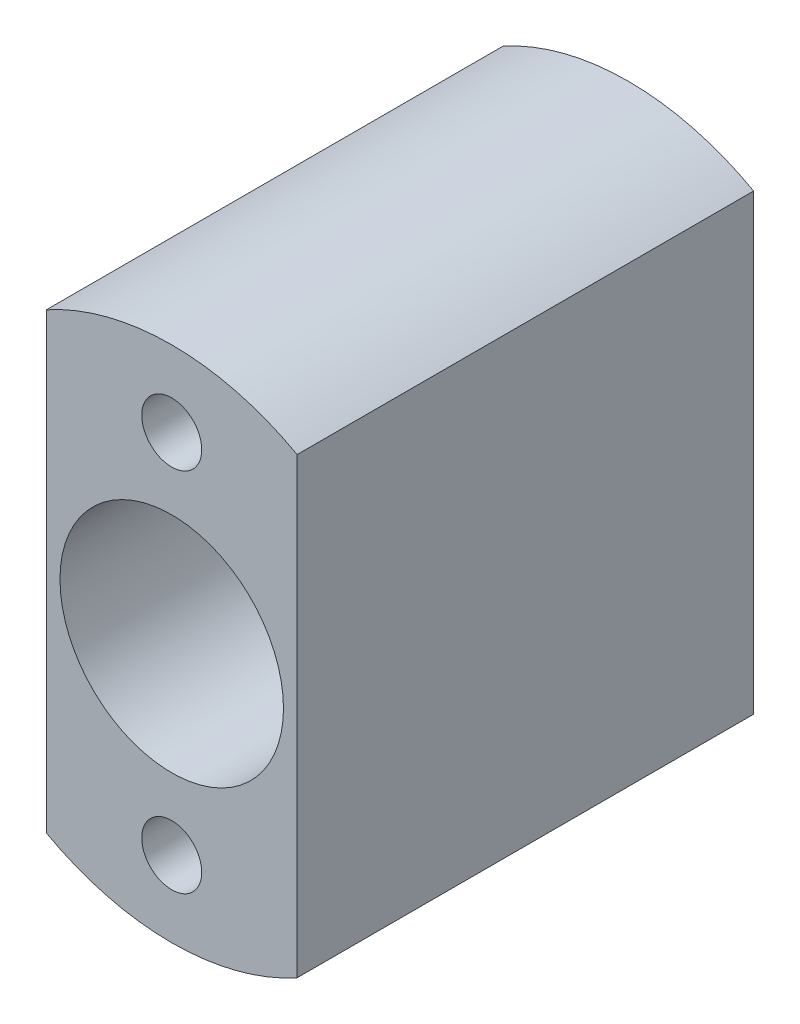
ISO-10303-21;
HEADER;
FILE_DESCRIPTION(('STEP AP214'),'2;1');
FILE_NAME('part.step','',(''),(''),'','','');
FILE_SCHEMA(('AUTOMOTIVE_DESIGN { 1 0 10303 214 1 1 1 1 }'));
ENDSEC;
DATA;
#1=APPLICATION_CONTEXT('core data for automotive mechanical design processes');
#2=APPLICATION_PROTOCOL_DEFINITION('international standard','automotive_design',2000,#1);
#3=PRODUCT_CONTEXT('',#1,'mechanical');
#4=PRODUCT('Part','Part','',(#3));
#5=PRODUCT_RELATED_PRODUCT_CATEGORY('part','',(#4));
#6=PRODUCT_DEFINITION_FORMATION('','',#4);
#7=PRODUCT_DEFINITION_CONTEXT('part definition',#1,'design');
#8=PRODUCT_DEFINITION('design','',#6,#7);
#9=PRODUCT_DEFINITION_SHAPE('','',#8);
#10=(LENGTH_UNIT() NAMED_UNIT(*) SI_UNIT(.MILLI.,.METRE.));
#11=(NAMED_UNIT(*) PLANE_ANGLE_UNIT() SI_UNIT($,.RADIAN.));
#12=(NAMED_UNIT(*) SI_UNIT($,.STERADIAN.) SOLID_ANGLE_UNIT());
#13=UNCERTAINTY_MEASURE_WITH_UNIT(LENGTH_MEASURE(1.E-05),#10,'distance_accuracy_value','');
#14=(GEOMETRIC_REPRESENTATION_CONTEXT(3) GLOBAL_UNCERTAINTY_ASSIGNED_CONTEXT((#13)) GLOBAL_UNIT_ASSIGNED_CONTEXT((#10,
#11,#12)) REPRESENTATION_CONTEXT('',''));
#15=CARTESIAN_POINT('',(0.,0.,0.));
#16=DIRECTION('',(0.,0.,1.));
#17=DIRECTION('',(1.,0.,0.));
#18=AXIS2_PLACEMENT_3D('',#15,#16,#17);
#19=CARTESIAN_POINT('',(0.,0.,16.75));
#20=DIRECTION('',(0.,0.,-1.));
#21=DIRECTION('',(-1.,0.,0.));
#22=AXIS2_PLACEMENT_3D('',#19,#20,#21);
#23=CYLINDRICAL_SURFACE('',#22,9.5);
#24=CARTESIAN_POINT('',(0.,0.,0.));
#25=DIRECTION('',(0.,0.,1.));
#26=DIRECTION('',(1.,0.,0.));
#27=AXIS2_PLACEMENT_3D('',#24,#25,#26);
#28=CIRCLE('',#27,9.5);
#29=CARTESIAN_POINT('',(-4.6,-8.31203946092654,0.));
#30=VERTEX_POINT('',#29);
#31=CARTESIAN_POINT('',(4.6,-8.31203946092654,0.));
#32=VERTEX_POINT('',#31);
#33=EDGE_CURVE('E112',#30,#32,#28,.T.);
#34=ORIENTED_EDGE('',*,*,#33,.T.);
#35=DIRECTION('',(0.,0.,-1.));
#36=VECTOR('',#35,1.);
#37=CARTESIAN_POINT('',(4.6,-8.31203946092654,16.75));
#38=LINE('',#37,#36);
#39=CARTESIAN_POINT('',(4.6,-8.31203946092654,16.75));
#40=VERTEX_POINT('',#39);
#41=EDGE_CURVE('E11',#40,#32,#38,.T.);
#42=ORIENTED_EDGE('',*,*,#41,.F.);
#43=CARTESIAN_POINT('',(0.,0.,16.75));
#44=DIRECTION('',(0.,0.,1.));
#45=DIRECTION('',(1.,0.,0.));
#46=AXIS2_PLACEMENT_3D('',#43,#44,#45);
#47=CIRCLE('',#46,9.5);
#48=CARTESIAN_POINT('',(-4.6,-8.31203946092654,16.75));
#49=VERTEX_POINT('',#48);
#50=EDGE_CURVE('E100',#49,#40,#47,.T.);
#51=ORIENTED_EDGE('',*,*,#50,.F.);
#52=DIRECTION('',(0.,0.,-1.));
#53=VECTOR('',#52,1.);
#54=CARTESIAN_POINT('',(-4.6,-8.31203946092654,16.75));
#55=LINE('',#54,#53);
#56=EDGE_CURVE('E108',#49,#30,#55,.T.);
#57=ORIENTED_EDGE('',*,*,#56,.T.);
#58=EDGE_LOOP('',(#34,#42,#51,#57));
#59=FACE_BOUND('',#58,.T.);
#60=ADVANCED_FACE('F49',(#59),#23,.T.);
#61=CARTESIAN_POINT('',(4.6,-8.31203946092654,16.75));
#62=DIRECTION('',(-1.,0.,0.));
#63=DIRECTION('',(0.,0.,1.));
#64=AXIS2_PLACEMENT_3D('',#61,#62,#63);
#65=PLANE('',#64);
#66=DIRECTION('',(0.,1.,0.));
#67=VECTOR('',#66,1.);
#68=CARTESIAN_POINT('',(4.6,-8.31203946092654,0.));
#69=LINE('',#68,#67);
#70=CARTESIAN_POINT('',(4.6,8.31203946092654,0.));
#71=VERTEX_POINT('',#70);
#72=EDGE_CURVE('E104',#32,#71,#69,.T.);
#73=ORIENTED_EDGE('',*,*,#72,.T.);
#74=DIRECTION('',(0.,0.,-1.));
#75=VECTOR('',#74,1.);
#76=CARTESIAN_POINT('',(4.6,8.31203946092654,16.75));
#77=LINE('',#76,#75);
#78=CARTESIAN_POINT('',(4.6,8.31203946092654,16.75));
#79=VERTEX_POINT('',#78);
#80=EDGE_CURVE('E57',#79,#71,#77,.T.);
#81=ORIENTED_EDGE('',*,*,#80,.F.);
#82=DIRECTION('',(0.,1.,0.));
#83=VECTOR('',#82,1.);
#84=CARTESIAN_POINT('',(4.6,-8.31203946092654,16.75));
#85=LINE('',#84,#83);
#86=EDGE_CURVE('E95',#40,#79,#85,.T.);
#87=ORIENTED_EDGE('',*,*,#86,.F.);
#88=ORIENTED_EDGE('',*,*,#41,.T.);
#89=EDGE_LOOP('',(#73,#81,#87,#88));
#90=FACE_BOUND('',#89,.T.);
#91=ADVANCED_FACE('F103',(#90),#65,.F.);
#92=CARTESIAN_POINT('',(0.,0.,16.75));
#93=DIRECTION('',(0.,0.,-1.));
#94=DIRECTION('',(-1.,0.,0.));
#95=AXIS2_PLACEMENT_3D('',#92,#93,#94);
#96=CYLINDRICAL_SURFACE('',#95,9.5);
#97=CARTESIAN_POINT('',(0.,0.,0.));
#98=DIRECTION('',(0.,0.,1.));
#99=DIRECTION('',(1.,0.,0.));
#100=AXIS2_PLACEMENT_3D('',#97,#98,#99);
#101=CIRCLE('',#100,9.5);
#102=CARTESIAN_POINT('',(-4.6,8.31203946092654,0.));
#103=VERTEX_POINT('',#102);
#104=EDGE_CURVE('E82',#71,#103,#101,.T.);
#105=ORIENTED_EDGE('',*,*,#104,.T.);
#106=DIRECTION('',(0.,0.,-1.));
#107=VECTOR('',#106,1.);
#108=CARTESIAN_POINT('',(-4.6,8.31203946092654,16.75));
#109=LINE('',#108,#107);
#110=CARTESIAN_POINT('',(-4.6,8.31203946092654,16.75));
#111=VERTEX_POINT('',#110);
#112=EDGE_CURVE('E105',#111,#103,#109,.T.);
#113=ORIENTED_EDGE('',*,*,#112,.F.);
#114=CARTESIAN_POINT('',(0.,0.,16.75));
#115=DIRECTION('',(0.,0.,1.));
#116=DIRECTION('',(1.,0.,0.));
#117=AXIS2_PLACEMENT_3D('',#114,#115,#116);
#118=CIRCLE('',#117,9.5);
#119=EDGE_CURVE('E98',#79,#111,#118,.T.);
#120=ORIENTED_EDGE('',*,*,#119,.F.);
#121=ORIENTED_EDGE('',*,*,#80,.T.);
#122=EDGE_LOOP('',(#105,#113,#120,#121));
#123=FACE_BOUND('',#122,.T.);
#124=ADVANCED_FACE('F106',(#123),#96,.T.);
#125=CARTESIAN_POINT('',(-4.6,-8.31203946092654,16.75));
#126=DIRECTION('',(1.,0.,0.));
#127=DIRECTION('',(0.,0.,-1.));
#128=AXIS2_PLACEMENT_3D('',#125,#126,#127);
#129=PLANE('',#128);
#130=DIRECTION('',(0.,-1.,0.));
#131=VECTOR('',#130,1.);
#132=CARTESIAN_POINT('',(-4.6,-8.31203946092654,0.));
#133=LINE('',#132,#131);
#134=EDGE_CURVE('E88',#103,#30,#133,.T.);
#135=ORIENTED_EDGE('',*,*,#134,.T.);
#136=ORIENTED_EDGE('',*,*,#56,.F.);
#137=DIRECTION('',(0.,-1.,0.));
#138=VECTOR('',#137,1.);
#139=CARTESIAN_POINT('',(-4.6,-8.31203946092654,16.75));
#140=LINE('',#139,#138);
#141=EDGE_CURVE('E65',#111,#49,#140,.T.);
#142=ORIENTED_EDGE('',*,*,#141,.F.);
#143=ORIENTED_EDGE('',*,*,#112,.T.);
#144=EDGE_LOOP('',(#135,#136,#142,#143));
#145=FACE_BOUND('',#144,.T.);
#146=ADVANCED_FACE('F120',(#145),#129,.F.);
#147=CARTESIAN_POINT('',(0.,0.,16.75));
#148=DIRECTION('',(0.,0.,1.));
#149=DIRECTION('',(1.,0.,0.));
#150=AXIS2_PLACEMENT_3D('',#147,#148,#149);
#151=PLANE('',#150);
#152=CARTESIAN_POINT('',(0.,0.,16.75));
#153=DIRECTION('',(0.,0.,1.));
#154=DIRECTION('',(1.,0.,0.));
#155=AXIS2_PLACEMENT_3D('',#152,#153,#154);
#156=CIRCLE('',#155,4.1);
#157=CARTESIAN_POINT('',(4.1,0.,16.75));
#158=VERTEX_POINT('',#157);
#159=EDGE_CURVE('E135',#158,#158,#156,.T.);
#160=ORIENTED_EDGE('',*,*,#159,.F.);
#161=EDGE_LOOP('',(#160));
#162=FACE_BOUND('',#161,.T.);
#163=CARTESIAN_POINT('',(0.,-6.715,16.75));
#164=DIRECTION('',(0.,0.,1.));
#165=DIRECTION('',(-1.,0.,0.));
#166=AXIS2_PLACEMENT_3D('',#163,#164,#165);
#167=CIRCLE('',#166,1.1);
#168=CARTESIAN_POINT('',(-1.1,-6.715,16.75));
#169=VERTEX_POINT('',#168);
#170=EDGE_CURVE('E132',#169,#169,#167,.T.);
#171=ORIENTED_EDGE('',*,*,#170,.F.);
#172=EDGE_LOOP('',(#171));
#173=FACE_BOUND('',#172,.T.);
#174=CARTESIAN_POINT('',(0.,6.715,16.75));
#175=DIRECTION('',(0.,0.,1.));
#176=DIRECTION('',(1.,0.,0.));
#177=AXIS2_PLACEMENT_3D('',#174,#175,#176);
#178=CIRCLE('',#177,1.1);
#179=CARTESIAN_POINT('',(1.1,6.715,16.75));
#180=VERTEX_POINT('',#179);
#181=EDGE_CURVE('E126',#180,#180,#178,.T.);
#182=ORIENTED_EDGE('',*,*,#181,.F.);
#183=EDGE_LOOP('',(#182));
#184=FACE_BOUND('',#183,.T.);
#185=ORIENTED_EDGE('',*,*,#50,.T.);
#186=ORIENTED_EDGE('',*,*,#86,.T.);
#187=ORIENTED_EDGE('',*,*,#119,.T.);
#188=ORIENTED_EDGE('',*,*,#141,.T.);
#189=EDGE_LOOP('',(#185,#186,#187,#188));
#190=FACE_BOUND('',#189,.T.);
#191=ADVANCED_FACE('F96',(#162,#173,#184,#190),#151,.T.);
#192=CARTESIAN_POINT('',(0.,0.,0.));
#193=DIRECTION('',(0.,0.,1.));
#194=DIRECTION('',(1.,0.,0.));
#195=AXIS2_PLACEMENT_3D('',#192,#193,#194);
#196=PLANE('',#195);
#197=CARTESIAN_POINT('',(0.,0.,0.));
#198=DIRECTION('',(0.,0.,-1.));
#199=DIRECTION('',(-1.,0.,0.));
#200=AXIS2_PLACEMENT_3D('',#197,#198,#199);
#201=CIRCLE('',#200,4.1);
#202=CARTESIAN_POINT('',(-4.1,0.,0.));
#203=VERTEX_POINT('',#202);
#204=EDGE_CURVE('E140',#203,#203,#201,.T.);
#205=ORIENTED_EDGE('',*,*,#204,.F.);
#206=EDGE_LOOP('',(#205));
#207=FACE_BOUND('',#206,.T.);
#208=CARTESIAN_POINT('',(0.,-6.715,0.));
#209=DIRECTION('',(0.,0.,1.));
#210=DIRECTION('',(-1.,0.,0.));
#211=AXIS2_PLACEMENT_3D('',#208,#209,#210);
#212=CIRCLE('',#211,1.1);
#213=CARTESIAN_POINT('',(-1.1,-6.715,0.));
#214=VERTEX_POINT('',#213);
#215=EDGE_CURVE('E129',#214,#214,#212,.T.);
#216=ORIENTED_EDGE('',*,*,#215,.T.);
#217=EDGE_LOOP('',(#216));
#218=FACE_BOUND('',#217,.T.);
#219=CARTESIAN_POINT('',(0.,6.715,0.));
#220=DIRECTION('',(0.,0.,1.));
#221=DIRECTION('',(1.,0.,0.));
#222=AXIS2_PLACEMENT_3D('',#219,#220,#221);
#223=CIRCLE('',#222,1.1);
#224=CARTESIAN_POINT('',(1.1,6.715,0.));
#225=VERTEX_POINT('',#224);
#226=EDGE_CURVE('E115',#225,#225,#223,.T.);
#227=ORIENTED_EDGE('',*,*,#226,.T.);
#228=EDGE_LOOP('',(#227));
#229=FACE_BOUND('',#228,.T.);
#230=ORIENTED_EDGE('',*,*,#33,.F.);
#231=ORIENTED_EDGE('',*,*,#134,.F.);
#232=ORIENTED_EDGE('',*,*,#104,.F.);
#233=ORIENTED_EDGE('',*,*,#72,.F.);
#234=EDGE_LOOP('',(#230,#231,#232,#233));
#235=FACE_BOUND('',#234,.T.);
#236=ADVANCED_FACE('F123',(#207,#218,#229,#235),#196,.F.);
#237=CARTESIAN_POINT('',(0.,6.715,0.));
#238=DIRECTION('',(0.,0.,1.));
#239=DIRECTION('',(1.,0.,0.));
#240=AXIS2_PLACEMENT_3D('',#237,#238,#239);
#241=CYLINDRICAL_SURFACE('',#240,1.1);
#242=ORIENTED_EDGE('',*,*,#226,.F.);
#243=EDGE_LOOP('',(#242));
#244=FACE_BOUND('',#243,.T.);
#245=ORIENTED_EDGE('',*,*,#181,.T.);
#246=EDGE_LOOP('',(#245));
#247=FACE_BOUND('',#246,.T.);
#248=ADVANCED_FACE('F148',(#244,#247),#241,.F.);
#249=CARTESIAN_POINT('',(0.,-6.715,0.));
#250=DIRECTION('',(0.,0.,1.));
#251=DIRECTION('',(1.,0.,0.));
#252=AXIS2_PLACEMENT_3D('',#249,#250,#251);
#253=CYLINDRICAL_SURFACE('',#252,1.1);
#254=ORIENTED_EDGE('',*,*,#215,.F.);
#255=EDGE_LOOP('',(#254));
#256=FACE_BOUND('',#255,.T.);
#257=ORIENTED_EDGE('',*,*,#170,.T.);
#258=EDGE_LOOP('',(#257));
#259=FACE_BOUND('',#258,.T.);
#260=ADVANCED_FACE('F156',(#256,#259),#253,.F.);
#261=CARTESIAN_POINT('',(0.,0.,24.));
#262=DIRECTION('',(0.,0.,-1.));
#263=DIRECTION('',(-1.,0.,0.));
#264=AXIS2_PLACEMENT_3D('',#261,#262,#263);
#265=CYLINDRICAL_SURFACE('',#264,4.1);
#266=ORIENTED_EDGE('',*,*,#159,.T.);
#267=EDGE_LOOP('',(#266));
#268=FACE_BOUND('',#267,.T.);
#269=ORIENTED_EDGE('',*,*,#204,.T.);
#270=EDGE_LOOP('',(#269));
#271=FACE_BOUND('',#270,.T.);
#272=ADVANCED_FACE('F144',(#268,#271),#265,.F.);
#273=CLOSED_SHELL('',(#60,#91,#124,#146,#191,#236,#248,#260,#272));
#274=MANIFOLD_SOLID_BREP('B2',#273);
#275=ADVANCED_BREP_SHAPE_REPRESENTATION('',(#18,#274),#14);
#276=SHAPE_DEFINITION_REPRESENTATION(#9,#275);
ENDSEC;
END-ISO-10303-21;
